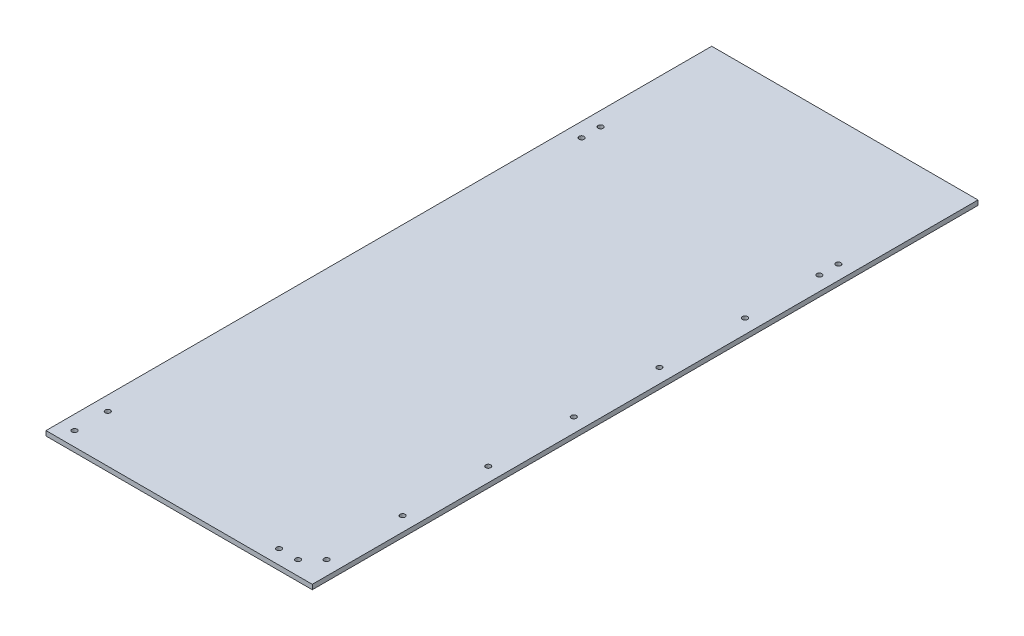
ISO-10303-21;
HEADER;
FILE_DESCRIPTION(('STEP AP214'),'2;1');
FILE_NAME('part.step','',(''),(''),'','','');
FILE_SCHEMA(('AUTOMOTIVE_DESIGN { 1 0 10303 214 1 1 1 1 }'));
ENDSEC;
DATA;
#1=APPLICATION_CONTEXT('core data for automotive mechanical design processes');
#2=APPLICATION_PROTOCOL_DEFINITION('international standard','automotive_design',2000,#1);
#3=PRODUCT_CONTEXT('',#1,'mechanical');
#4=PRODUCT('Part','Part','',(#3));
#5=PRODUCT_RELATED_PRODUCT_CATEGORY('part','',(#4));
#6=PRODUCT_DEFINITION_FORMATION('','',#4);
#7=PRODUCT_DEFINITION_CONTEXT('part definition',#1,'design');
#8=PRODUCT_DEFINITION('design','',#6,#7);
#9=PRODUCT_DEFINITION_SHAPE('','',#8);
#10=(LENGTH_UNIT() NAMED_UNIT(*) SI_UNIT(.MILLI.,.METRE.));
#11=(NAMED_UNIT(*) PLANE_ANGLE_UNIT() SI_UNIT($,.RADIAN.));
#12=(NAMED_UNIT(*) SI_UNIT($,.STERADIAN.) SOLID_ANGLE_UNIT());
#13=UNCERTAINTY_MEASURE_WITH_UNIT(LENGTH_MEASURE(1.E-05),#10,'distance_accuracy_value','');
#14=(GEOMETRIC_REPRESENTATION_CONTEXT(3) GLOBAL_UNCERTAINTY_ASSIGNED_CONTEXT((#13)) GLOBAL_UNIT_ASSIGNED_CONTEXT((#10,
#11,#12)) REPRESENTATION_CONTEXT('',''));
#15=CARTESIAN_POINT('',(0.,0.,0.));
#16=DIRECTION('',(0.,0.,1.));
#17=DIRECTION('',(1.,0.,0.));
#18=AXIS2_PLACEMENT_3D('',#15,#16,#17);
#19=CARTESIAN_POINT('',(-158.749999995191,-951.153359001941,425.450000001205));
#20=DIRECTION('',(0.,1.,0.));
#21=DIRECTION('',(1.,0.,0.));
#22=AXIS2_PLACEMENT_3D('',#19,#20,#21);
#23=CYLINDRICAL_SURFACE('',#22,3.3782);
#24=CARTESIAN_POINT('',(-158.749999995191,0.,425.450000001205));
#25=DIRECTION('',(0.,1.,0.));
#26=DIRECTION('',(1.,0.,0.));
#27=AXIS2_PLACEMENT_3D('',#24,#25,#26);
#28=CIRCLE('',#27,3.3782);
#29=CARTESIAN_POINT('',(-155.371799995191,0.,425.450000001205));
#30=VERTEX_POINT('',#29);
#31=EDGE_CURVE('E95',#30,#30,#28,.T.);
#32=ORIENTED_EDGE('',*,*,#31,.F.);
#33=EDGE_LOOP('',(#32));
#34=FACE_BOUND('',#33,.T.);
#35=CARTESIAN_POINT('',(-158.749999995191,6.35000000000005,425.450000001205));
#36=DIRECTION('',(0.,-1.,0.));
#37=DIRECTION('',(0.,0.,-1.));
#38=AXIS2_PLACEMENT_3D('',#35,#36,#37);
#39=CIRCLE('',#38,3.3782);
#40=CARTESIAN_POINT('',(-158.749999995191,6.35000000000005,422.071800001205));
#41=VERTEX_POINT('',#40);
#42=EDGE_CURVE('E76',#41,#41,#39,.T.);
#43=ORIENTED_EDGE('',*,*,#42,.F.);
#44=EDGE_LOOP('',(#43));
#45=FACE_BOUND('',#44,.T.);
#46=ADVANCED_FACE('F16',(#34,#45),#23,.F.);
#47=CARTESIAN_POINT('',(-158.749999995512,-951.153359001941,381.000000001207));
#48=DIRECTION('',(0.,1.,0.));
#49=DIRECTION('',(1.,0.,0.));
#50=AXIS2_PLACEMENT_3D('',#47,#48,#49);
#51=CYLINDRICAL_SURFACE('',#50,3.3782);
#52=CARTESIAN_POINT('',(-158.749999995512,0.,381.000000001207));
#53=DIRECTION('',(0.,1.,0.));
#54=DIRECTION('',(1.,0.,0.));
#55=AXIS2_PLACEMENT_3D('',#52,#53,#54);
#56=CIRCLE('',#55,3.3782);
#57=CARTESIAN_POINT('',(-155.371799995512,0.,381.000000001207));
#58=VERTEX_POINT('',#57);
#59=EDGE_CURVE('E170',#58,#58,#56,.T.);
#60=ORIENTED_EDGE('',*,*,#59,.F.);
#61=EDGE_LOOP('',(#60));
#62=FACE_BOUND('',#61,.T.);
#63=CARTESIAN_POINT('',(-158.749999995512,6.35000000000005,381.000000001207));
#64=DIRECTION('',(0.,-1.,0.));
#65=DIRECTION('',(0.,0.,-1.));
#66=AXIS2_PLACEMENT_3D('',#63,#64,#65);
#67=CIRCLE('',#66,3.3782);
#68=CARTESIAN_POINT('',(-158.749999995512,6.35000000000005,377.621800001207));
#69=VERTEX_POINT('',#68);
#70=EDGE_CURVE('E167',#69,#69,#67,.T.);
#71=ORIENTED_EDGE('',*,*,#70,.F.);
#72=EDGE_LOOP('',(#71));
#73=FACE_BOUND('',#72,.T.);
#74=ADVANCED_FACE('F184',(#62,#73),#51,.F.);
#75=CARTESIAN_POINT('',(158.750000004656,-951.153359001941,406.399999998914));
#76=DIRECTION('',(0.,1.,0.));
#77=DIRECTION('',(1.,0.,0.));
#78=AXIS2_PLACEMENT_3D('',#75,#76,#77);
#79=CYLINDRICAL_SURFACE('',#78,3.3782);
#80=CARTESIAN_POINT('',(158.750000004656,0.,406.399999998914));
#81=DIRECTION('',(0.,1.,0.));
#82=DIRECTION('',(1.,0.,0.));
#83=AXIS2_PLACEMENT_3D('',#80,#81,#82);
#84=CIRCLE('',#83,3.3782);
#85=CARTESIAN_POINT('',(162.128200004656,0.,406.399999998914));
#86=VERTEX_POINT('',#85);
#87=EDGE_CURVE('E164',#86,#86,#84,.T.);
#88=ORIENTED_EDGE('',*,*,#87,.F.);
#89=EDGE_LOOP('',(#88));
#90=FACE_BOUND('',#89,.T.);
#91=CARTESIAN_POINT('',(158.750000004656,6.35000000000005,406.399999998914));
#92=DIRECTION('',(0.,-1.,0.));
#93=DIRECTION('',(0.,0.,-1.));
#94=AXIS2_PLACEMENT_3D('',#91,#92,#93);
#95=CIRCLE('',#94,3.3782);
#96=CARTESIAN_POINT('',(158.750000004656,6.35000000000005,403.021799998914));
#97=VERTEX_POINT('',#96);
#98=EDGE_CURVE('E161',#97,#97,#95,.T.);
#99=ORIENTED_EDGE('',*,*,#98,.F.);
#100=EDGE_LOOP('',(#99));
#101=FACE_BOUND('',#100,.T.);
#102=ADVANCED_FACE('F342',(#90,#101),#79,.F.);
#103=CARTESIAN_POINT('',(139.700000004794,-951.153359001941,425.449999999051));
#104=DIRECTION('',(0.,1.,0.));
#105=DIRECTION('',(1.,0.,0.));
#106=AXIS2_PLACEMENT_3D('',#103,#104,#105);
#107=CYLINDRICAL_SURFACE('',#106,3.3782);
#108=CARTESIAN_POINT('',(139.700000004794,0.,425.449999999051));
#109=DIRECTION('',(0.,1.,0.));
#110=DIRECTION('',(1.,0.,0.));
#111=AXIS2_PLACEMENT_3D('',#108,#109,#110);
#112=CIRCLE('',#111,3.3782);
#113=CARTESIAN_POINT('',(143.078200004794,0.,425.449999999051));
#114=VERTEX_POINT('',#113);
#115=EDGE_CURVE('E158',#114,#114,#112,.T.);
#116=ORIENTED_EDGE('',*,*,#115,.F.);
#117=EDGE_LOOP('',(#116));
#118=FACE_BOUND('',#117,.T.);
#119=CARTESIAN_POINT('',(139.700000004794,6.35000000000005,425.449999999051));
#120=DIRECTION('',(0.,-1.,0.));
#121=DIRECTION('',(0.,0.,-1.));
#122=AXIS2_PLACEMENT_3D('',#119,#120,#121);
#123=CIRCLE('',#122,3.3782);
#124=CARTESIAN_POINT('',(139.700000004794,6.35000000000005,422.071799999051));
#125=VERTEX_POINT('',#124);
#126=EDGE_CURVE('E155',#125,#125,#123,.T.);
#127=ORIENTED_EDGE('',*,*,#126,.F.);
#128=EDGE_LOOP('',(#127));
#129=FACE_BOUND('',#128,.T.);
#130=ADVANCED_FACE('F334',(#118,#129),#107,.F.);
#131=CARTESIAN_POINT('',(114.300000004795,-951.153359001941,425.449999999234));
#132=DIRECTION('',(0.,1.,0.));
#133=DIRECTION('',(1.,0.,0.));
#134=AXIS2_PLACEMENT_3D('',#131,#132,#133);
#135=CYLINDRICAL_SURFACE('',#134,3.3782);
#136=CARTESIAN_POINT('',(114.300000004795,0.,425.449999999234));
#137=DIRECTION('',(0.,1.,0.));
#138=DIRECTION('',(1.,0.,0.));
#139=AXIS2_PLACEMENT_3D('',#136,#137,#138);
#140=CIRCLE('',#139,3.3782);
#141=CARTESIAN_POINT('',(117.678200004795,0.,425.449999999234));
#142=VERTEX_POINT('',#141);
#143=EDGE_CURVE('E152',#142,#142,#140,.T.);
#144=ORIENTED_EDGE('',*,*,#143,.F.);
#145=EDGE_LOOP('',(#144));
#146=FACE_BOUND('',#145,.T.);
#147=CARTESIAN_POINT('',(114.300000004795,6.35000000000005,425.449999999234));
#148=DIRECTION('',(0.,-1.,0.));
#149=DIRECTION('',(0.,0.,-1.));
#150=AXIS2_PLACEMENT_3D('',#147,#148,#149);
#151=CIRCLE('',#150,3.3782);
#152=CARTESIAN_POINT('',(114.300000004795,6.35000000000005,422.071799999234));
#153=VERTEX_POINT('',#152);
#154=EDGE_CURVE('E149',#153,#153,#151,.T.);
#155=ORIENTED_EDGE('',*,*,#154,.F.);
#156=EDGE_LOOP('',(#155));
#157=FACE_BOUND('',#156,.T.);
#158=ADVANCED_FACE('F326',(#146,#157),#135,.F.);
#159=CARTESIAN_POINT('',(158.750000000001,-951.153359001941,-277.109418015801));
#160=DIRECTION('',(0.,1.,0.));
#161=DIRECTION('',(1.,0.,0.));
#162=AXIS2_PLACEMENT_3D('',#159,#160,#161);
#163=CYLINDRICAL_SURFACE('',#162,3.3782);
#164=CARTESIAN_POINT('',(158.750000000001,0.,-277.109418015801));
#165=DIRECTION('',(0.,1.,0.));
#166=DIRECTION('',(1.,0.,0.));
#167=AXIS2_PLACEMENT_3D('',#164,#165,#166);
#168=CIRCLE('',#167,3.3782);
#169=CARTESIAN_POINT('',(162.128200000001,0.,-277.109418015801));
#170=VERTEX_POINT('',#169);
#171=EDGE_CURVE('E146',#170,#170,#168,.T.);
#172=ORIENTED_EDGE('',*,*,#171,.F.);
#173=EDGE_LOOP('',(#172));
#174=FACE_BOUND('',#173,.T.);
#175=CARTESIAN_POINT('',(158.750000000001,6.35000000000005,-277.109418015801));
#176=DIRECTION('',(0.,-1.,0.));
#177=DIRECTION('',(0.,0.,-1.));
#178=AXIS2_PLACEMENT_3D('',#175,#176,#177);
#179=CIRCLE('',#178,3.3782);
#180=CARTESIAN_POINT('',(158.750000000001,6.35000000000005,-280.487618015801));
#181=VERTEX_POINT('',#180);
#182=EDGE_CURVE('E143',#181,#181,#179,.T.);
#183=ORIENTED_EDGE('',*,*,#182,.F.);
#184=EDGE_LOOP('',(#183));
#185=FACE_BOUND('',#184,.T.);
#186=ADVANCED_FACE('F318',(#174,#185),#163,.F.);
#187=CARTESIAN_POINT('',(158.750000000001,-951.153359001941,-251.709418015802));
#188=DIRECTION('',(0.,1.,0.));
#189=DIRECTION('',(1.,0.,0.));
#190=AXIS2_PLACEMENT_3D('',#187,#188,#189);
#191=CYLINDRICAL_SURFACE('',#190,3.3782);
#192=CARTESIAN_POINT('',(158.750000000001,0.,-251.709418015802));
#193=DIRECTION('',(0.,1.,0.));
#194=DIRECTION('',(1.,0.,0.));
#195=AXIS2_PLACEMENT_3D('',#192,#193,#194);
#196=CIRCLE('',#195,3.3782);
#197=CARTESIAN_POINT('',(162.128200000001,0.,-251.709418015802));
#198=VERTEX_POINT('',#197);
#199=EDGE_CURVE('E140',#198,#198,#196,.T.);
#200=ORIENTED_EDGE('',*,*,#199,.F.);
#201=EDGE_LOOP('',(#200));
#202=FACE_BOUND('',#201,.T.);
#203=CARTESIAN_POINT('',(158.750000000001,6.35000000000005,-251.709418015802));
#204=DIRECTION('',(0.,-1.,0.));
#205=DIRECTION('',(0.,0.,-1.));
#206=AXIS2_PLACEMENT_3D('',#203,#204,#205);
#207=CIRCLE('',#206,3.3782);
#208=CARTESIAN_POINT('',(158.750000000001,6.35000000000005,-255.087618015802));
#209=VERTEX_POINT('',#208);
#210=EDGE_CURVE('E137',#209,#209,#207,.T.);
#211=ORIENTED_EDGE('',*,*,#210,.F.);
#212=EDGE_LOOP('',(#211));
#213=FACE_BOUND('',#212,.T.);
#214=ADVANCED_FACE('F310',(#202,#213),#191,.F.);
#215=CARTESIAN_POINT('',(-158.750000005025,-951.153359001941,-251.709418013566));
#216=DIRECTION('',(0.,1.,0.));
#217=DIRECTION('',(1.,0.,0.));
#218=AXIS2_PLACEMENT_3D('',#215,#216,#217);
#219=CYLINDRICAL_SURFACE('',#218,3.3782);
#220=CARTESIAN_POINT('',(-158.750000005025,0.,-251.709418013566));
#221=DIRECTION('',(0.,1.,0.));
#222=DIRECTION('',(1.,0.,0.));
#223=AXIS2_PLACEMENT_3D('',#220,#221,#222);
#224=CIRCLE('',#223,3.3782);
#225=CARTESIAN_POINT('',(-155.371800005025,0.,-251.709418013566));
#226=VERTEX_POINT('',#225);
#227=EDGE_CURVE('E134',#226,#226,#224,.T.);
#228=ORIENTED_EDGE('',*,*,#227,.F.);
#229=EDGE_LOOP('',(#228));
#230=FACE_BOUND('',#229,.T.);
#231=CARTESIAN_POINT('',(-158.750000005025,6.35000000000005,-251.709418013566));
#232=DIRECTION('',(0.,-1.,0.));
#233=DIRECTION('',(0.,0.,-1.));
#234=AXIS2_PLACEMENT_3D('',#231,#232,#233);
#235=CIRCLE('',#234,3.3782);
#236=CARTESIAN_POINT('',(-158.750000005025,6.35000000000005,-255.087618013566));
#237=VERTEX_POINT('',#236);
#238=EDGE_CURVE('E131',#237,#237,#235,.T.);
#239=ORIENTED_EDGE('',*,*,#238,.F.);
#240=EDGE_LOOP('',(#239));
#241=FACE_BOUND('',#240,.T.);
#242=ADVANCED_FACE('F302',(#230,#241),#219,.F.);
#243=CARTESIAN_POINT('',(-158.750000005209,-951.153359001941,-277.109418013564));
#244=DIRECTION('',(0.,1.,0.));
#245=DIRECTION('',(1.,0.,0.));
#246=AXIS2_PLACEMENT_3D('',#243,#244,#245);
#247=CYLINDRICAL_SURFACE('',#246,3.3782);
#248=CARTESIAN_POINT('',(-158.750000005209,0.,-277.109418013564));
#249=DIRECTION('',(0.,1.,0.));
#250=DIRECTION('',(1.,0.,0.));
#251=AXIS2_PLACEMENT_3D('',#248,#249,#250);
#252=CIRCLE('',#251,3.3782);
#253=CARTESIAN_POINT('',(-155.371800005209,0.,-277.109418013564));
#254=VERTEX_POINT('',#253);
#255=EDGE_CURVE('E128',#254,#254,#252,.T.);
#256=ORIENTED_EDGE('',*,*,#255,.F.);
#257=EDGE_LOOP('',(#256));
#258=FACE_BOUND('',#257,.T.);
#259=CARTESIAN_POINT('',(-158.750000005209,6.35000000000005,-277.109418013564));
#260=DIRECTION('',(0.,-1.,0.));
#261=DIRECTION('',(0.,0.,-1.));
#262=AXIS2_PLACEMENT_3D('',#259,#260,#261);
#263=CIRCLE('',#262,3.3782);
#264=CARTESIAN_POINT('',(-158.750000005209,6.35000000000005,-280.487618013564));
#265=VERTEX_POINT('',#264);
#266=EDGE_CURVE('E125',#265,#265,#263,.T.);
#267=ORIENTED_EDGE('',*,*,#266,.F.);
#268=EDGE_LOOP('',(#267));
#269=FACE_BOUND('',#268,.T.);
#270=ADVANCED_FACE('F294',(#258,#269),#247,.F.);
#271=CARTESIAN_POINT('',(158.75,-951.153359001941,-152.399999999995));
#272=DIRECTION('',(0.,1.,0.));
#273=DIRECTION('',(1.,0.,0.));
#274=AXIS2_PLACEMENT_3D('',#271,#272,#273);
#275=CYLINDRICAL_SURFACE('',#274,3.3782);
#276=CARTESIAN_POINT('',(158.75,0.,-152.399999999995));
#277=DIRECTION('',(0.,1.,0.));
#278=DIRECTION('',(1.,0.,0.));
#279=AXIS2_PLACEMENT_3D('',#276,#277,#278);
#280=CIRCLE('',#279,3.3782);
#281=CARTESIAN_POINT('',(162.1282,0.,-152.399999999995));
#282=VERTEX_POINT('',#281);
#283=EDGE_CURVE('E122',#282,#282,#280,.T.);
#284=ORIENTED_EDGE('',*,*,#283,.F.);
#285=EDGE_LOOP('',(#284));
#286=FACE_BOUND('',#285,.T.);
#287=CARTESIAN_POINT('',(158.75,6.35000000000005,-152.399999999995));
#288=DIRECTION('',(0.,-1.,0.));
#289=DIRECTION('',(0.,0.,-1.));
#290=AXIS2_PLACEMENT_3D('',#287,#288,#289);
#291=CIRCLE('',#290,3.3782);
#292=CARTESIAN_POINT('',(158.75,6.35000000000005,-155.778199999995));
#293=VERTEX_POINT('',#292);
#294=EDGE_CURVE('E119',#293,#293,#291,.T.);
#295=ORIENTED_EDGE('',*,*,#294,.F.);
#296=EDGE_LOOP('',(#295));
#297=FACE_BOUND('',#296,.T.);
#298=ADVANCED_FACE('F287',(#286,#297),#275,.F.);
#299=CARTESIAN_POINT('',(158.75,-951.153359001941,76.2000000000049));
#300=DIRECTION('',(0.,1.,0.));
#301=DIRECTION('',(1.,0.,0.));
#302=AXIS2_PLACEMENT_3D('',#299,#300,#301);
#303=CYLINDRICAL_SURFACE('',#302,3.3782);
#304=CARTESIAN_POINT('',(158.75,0.,76.2000000000049));
#305=DIRECTION('',(0.,1.,0.));
#306=DIRECTION('',(1.,0.,0.));
#307=AXIS2_PLACEMENT_3D('',#304,#305,#306);
#308=CIRCLE('',#307,3.3782);
#309=CARTESIAN_POINT('',(162.1282,0.,76.2000000000049));
#310=VERTEX_POINT('',#309);
#311=EDGE_CURVE('E111',#310,#310,#308,.T.);
#312=ORIENTED_EDGE('',*,*,#311,.F.);
#313=EDGE_LOOP('',(#312));
#314=FACE_BOUND('',#313,.T.);
#315=CARTESIAN_POINT('',(158.75,6.35000000000005,76.2000000000049));
#316=DIRECTION('',(0.,-1.,0.));
#317=DIRECTION('',(0.,0.,-1.));
#318=AXIS2_PLACEMENT_3D('',#315,#316,#317);
#319=CIRCLE('',#318,3.3782);
#320=CARTESIAN_POINT('',(158.75,6.35000000000005,72.8218000000049));
#321=VERTEX_POINT('',#320);
#322=EDGE_CURVE('E115',#321,#321,#319,.T.);
#323=ORIENTED_EDGE('',*,*,#322,.F.);
#324=EDGE_LOOP('',(#323));
#325=FACE_BOUND('',#324,.T.);
#326=ADVANCED_FACE('F228',(#314,#325),#303,.F.);
#327=CARTESIAN_POINT('',(158.75,-951.153359001941,190.500000000005));
#328=DIRECTION('',(0.,1.,0.));
#329=DIRECTION('',(1.,0.,0.));
#330=AXIS2_PLACEMENT_3D('',#327,#328,#329);
#331=CYLINDRICAL_SURFACE('',#330,3.3782);
#332=CARTESIAN_POINT('',(158.75,0.,190.500000000005));
#333=DIRECTION('',(0.,1.,0.));
#334=DIRECTION('',(1.,0.,0.));
#335=AXIS2_PLACEMENT_3D('',#332,#333,#334);
#336=CIRCLE('',#335,3.3782);
#337=CARTESIAN_POINT('',(162.1282,0.,190.500000000005));
#338=VERTEX_POINT('',#337);
#339=EDGE_CURVE('E106',#338,#338,#336,.T.);
#340=ORIENTED_EDGE('',*,*,#339,.F.);
#341=EDGE_LOOP('',(#340));
#342=FACE_BOUND('',#341,.T.);
#343=CARTESIAN_POINT('',(158.75,6.35000000000005,190.500000000005));
#344=DIRECTION('',(0.,-1.,0.));
#345=DIRECTION('',(0.,0.,-1.));
#346=AXIS2_PLACEMENT_3D('',#343,#344,#345);
#347=CIRCLE('',#346,3.3782);
#348=CARTESIAN_POINT('',(158.75,6.35000000000005,187.121800000005));
#349=VERTEX_POINT('',#348);
#350=EDGE_CURVE('E87',#349,#349,#347,.T.);
#351=ORIENTED_EDGE('',*,*,#350,.F.);
#352=EDGE_LOOP('',(#351));
#353=FACE_BOUND('',#352,.T.);
#354=ADVANCED_FACE('F217',(#342,#353),#331,.F.);
#355=CARTESIAN_POINT('',(158.75,-951.153359001941,-38.099999999995));
#356=DIRECTION('',(0.,1.,0.));
#357=DIRECTION('',(1.,0.,0.));
#358=AXIS2_PLACEMENT_3D('',#355,#356,#357);
#359=CYLINDRICAL_SURFACE('',#358,3.3782);
#360=CARTESIAN_POINT('',(158.75,0.,-38.099999999995));
#361=DIRECTION('',(0.,1.,0.));
#362=DIRECTION('',(1.,0.,0.));
#363=AXIS2_PLACEMENT_3D('',#360,#361,#362);
#364=CIRCLE('',#363,3.3782);
#365=CARTESIAN_POINT('',(162.1282,0.,-38.099999999995));
#366=VERTEX_POINT('',#365);
#367=EDGE_CURVE('E102',#366,#366,#364,.T.);
#368=ORIENTED_EDGE('',*,*,#367,.F.);
#369=EDGE_LOOP('',(#368));
#370=FACE_BOUND('',#369,.T.);
#371=CARTESIAN_POINT('',(158.75,6.35000000000005,-38.099999999995));
#372=DIRECTION('',(0.,-1.,0.));
#373=DIRECTION('',(0.,0.,-1.));
#374=AXIS2_PLACEMENT_3D('',#371,#372,#373);
#375=CIRCLE('',#374,3.3782);
#376=CARTESIAN_POINT('',(158.75,6.35000000000005,-41.478199999995));
#377=VERTEX_POINT('',#376);
#378=EDGE_CURVE('E82',#377,#377,#375,.T.);
#379=ORIENTED_EDGE('',*,*,#378,.F.);
#380=EDGE_LOOP('',(#379));
#381=FACE_BOUND('',#380,.T.);
#382=ADVANCED_FACE('F214',(#370,#381),#359,.F.);
#383=CARTESIAN_POINT('',(158.75,-951.153359001941,304.800000000005));
#384=DIRECTION('',(0.,1.,0.));
#385=DIRECTION('',(1.,0.,0.));
#386=AXIS2_PLACEMENT_3D('',#383,#384,#385);
#387=CYLINDRICAL_SURFACE('',#386,3.3782);
#388=CARTESIAN_POINT('',(158.75,0.,304.800000000005));
#389=DIRECTION('',(0.,1.,0.));
#390=DIRECTION('',(1.,0.,0.));
#391=AXIS2_PLACEMENT_3D('',#388,#389,#390);
#392=CIRCLE('',#391,3.3782);
#393=CARTESIAN_POINT('',(162.1282,0.,304.800000000005));
#394=VERTEX_POINT('',#393);
#395=EDGE_CURVE('E91',#394,#394,#392,.T.);
#396=ORIENTED_EDGE('',*,*,#395,.F.);
#397=EDGE_LOOP('',(#396));
#398=FACE_BOUND('',#397,.T.);
#399=CARTESIAN_POINT('',(158.75,6.35000000000005,304.800000000005));
#400=DIRECTION('',(0.,-1.,0.));
#401=DIRECTION('',(0.,0.,-1.));
#402=AXIS2_PLACEMENT_3D('',#399,#400,#401);
#403=CIRCLE('',#402,3.3782);
#404=CARTESIAN_POINT('',(158.75,6.35000000000005,301.421800000005));
#405=VERTEX_POINT('',#404);
#406=EDGE_CURVE('E80',#405,#405,#403,.T.);
#407=ORIENTED_EDGE('',*,*,#406,.F.);
#408=EDGE_LOOP('',(#407));
#409=FACE_BOUND('',#408,.T.);
#410=ADVANCED_FACE('F216',(#398,#409),#387,.F.);
#411=CARTESIAN_POINT('',(-177.8,0.,-444.5));
#412=DIRECTION('',(-1.,0.,0.));
#413=DIRECTION('',(0.,0.,1.));
#414=AXIS2_PLACEMENT_3D('',#411,#412,#413);
#415=PLANE('',#414);
#416=DIRECTION('',(0.,0.,-1.));
#417=VECTOR('',#416,1.);
#418=CARTESIAN_POINT('',(-177.8,0.,444.5));
#419=LINE('',#418,#417);
#420=CARTESIAN_POINT('',(-177.8,0.,444.5));
#421=VERTEX_POINT('',#420);
#422=CARTESIAN_POINT('',(-177.8,0.,-444.5));
#423=VERTEX_POINT('',#422);
#424=EDGE_CURVE('E34',#421,#423,#419,.T.);
#425=ORIENTED_EDGE('',*,*,#424,.F.);
#426=DIRECTION('',(0.,1.,0.));
#427=VECTOR('',#426,1.);
#428=CARTESIAN_POINT('',(-177.8,0.,444.5));
#429=LINE('',#428,#427);
#430=CARTESIAN_POINT('',(-177.8,6.35,444.5));
#431=VERTEX_POINT('',#430);
#432=EDGE_CURVE('E11',#421,#431,#429,.T.);
#433=ORIENTED_EDGE('',*,*,#432,.T.);
#434=DIRECTION('',(0.,0.,1.));
#435=VECTOR('',#434,1.);
#436=CARTESIAN_POINT('',(-177.8,6.35,444.5));
#437=LINE('',#436,#435);
#438=CARTESIAN_POINT('',(-177.8,6.35,-444.5));
#439=VERTEX_POINT('',#438);
#440=EDGE_CURVE('E79',#439,#431,#437,.T.);
#441=ORIENTED_EDGE('',*,*,#440,.F.);
#442=DIRECTION('',(0.,1.,0.));
#443=VECTOR('',#442,1.);
#444=CARTESIAN_POINT('',(-177.8,0.,-444.5));
#445=LINE('',#444,#443);
#446=EDGE_CURVE('E26',#423,#439,#445,.T.);
#447=ORIENTED_EDGE('',*,*,#446,.F.);
#448=EDGE_LOOP('',(#425,#433,#441,#447));
#449=FACE_BOUND('',#448,.T.);
#450=ADVANCED_FACE('F225',(#449),#415,.T.);
#451=CARTESIAN_POINT('',(177.8,0.,-444.5));
#452=DIRECTION('',(0.,0.,-1.));
#453=DIRECTION('',(-1.,0.,0.));
#454=AXIS2_PLACEMENT_3D('',#451,#452,#453);
#455=PLANE('',#454);
#456=DIRECTION('',(1.,0.,0.));
#457=VECTOR('',#456,1.);
#458=CARTESIAN_POINT('',(-177.8,0.,-444.5));
#459=LINE('',#458,#457);
#460=CARTESIAN_POINT('',(177.8,0.,-444.5));
#461=VERTEX_POINT('',#460);
#462=EDGE_CURVE('E92',#423,#461,#459,.T.);
#463=ORIENTED_EDGE('',*,*,#462,.F.);
#464=ORIENTED_EDGE('',*,*,#446,.T.);
#465=DIRECTION('',(-1.,0.,0.));
#466=VECTOR('',#465,1.);
#467=CARTESIAN_POINT('',(-177.8,6.35,-444.5));
#468=LINE('',#467,#466);
#469=CARTESIAN_POINT('',(177.8,6.35,-444.5));
#470=VERTEX_POINT('',#469);
#471=EDGE_CURVE('E70',#470,#439,#468,.T.);
#472=ORIENTED_EDGE('',*,*,#471,.F.);
#473=DIRECTION('',(0.,1.,0.));
#474=VECTOR('',#473,1.);
#475=CARTESIAN_POINT('',(177.8,0.,-444.5));
#476=LINE('',#475,#474);
#477=EDGE_CURVE('E66',#461,#470,#476,.T.);
#478=ORIENTED_EDGE('',*,*,#477,.F.);
#479=EDGE_LOOP('',(#463,#464,#472,#478));
#480=FACE_BOUND('',#479,.T.);
#481=ADVANCED_FACE('F235',(#480),#455,.T.);
#482=CARTESIAN_POINT('',(177.8,0.,444.5));
#483=DIRECTION('',(1.,0.,0.));
#484=DIRECTION('',(0.,0.,-1.));
#485=AXIS2_PLACEMENT_3D('',#482,#483,#484);
#486=PLANE('',#485);
#487=DIRECTION('',(0.,0.,1.));
#488=VECTOR('',#487,1.);
#489=CARTESIAN_POINT('',(177.8,0.,-444.5));
#490=LINE('',#489,#488);
#491=CARTESIAN_POINT('',(177.8,0.,444.5));
#492=VERTEX_POINT('',#491);
#493=EDGE_CURVE('E54',#461,#492,#490,.T.);
#494=ORIENTED_EDGE('',*,*,#493,.F.);
#495=ORIENTED_EDGE('',*,*,#477,.T.);
#496=DIRECTION('',(0.,0.,-1.));
#497=VECTOR('',#496,1.);
#498=CARTESIAN_POINT('',(177.8,6.35,-444.5));
#499=LINE('',#498,#497);
#500=CARTESIAN_POINT('',(177.8,6.35,444.5));
#501=VERTEX_POINT('',#500);
#502=EDGE_CURVE('E60',#501,#470,#499,.T.);
#503=ORIENTED_EDGE('',*,*,#502,.F.);
#504=DIRECTION('',(0.,1.,0.));
#505=VECTOR('',#504,1.);
#506=CARTESIAN_POINT('',(177.8,0.,444.5));
#507=LINE('',#506,#505);
#508=EDGE_CURVE('E63',#492,#501,#507,.T.);
#509=ORIENTED_EDGE('',*,*,#508,.F.);
#510=EDGE_LOOP('',(#494,#495,#503,#509));
#511=FACE_BOUND('',#510,.T.);
#512=ADVANCED_FACE('F62',(#511),#486,.T.);
#513=CARTESIAN_POINT('',(-177.8,0.,444.5));
#514=DIRECTION('',(0.,0.,1.));
#515=DIRECTION('',(1.,0.,0.));
#516=AXIS2_PLACEMENT_3D('',#513,#514,#515);
#517=PLANE('',#516);
#518=DIRECTION('',(-1.,0.,0.));
#519=VECTOR('',#518,1.);
#520=CARTESIAN_POINT('',(177.8,0.,444.5));
#521=LINE('',#520,#519);
#522=EDGE_CURVE('E75',#492,#421,#521,.T.);
#523=ORIENTED_EDGE('',*,*,#522,.F.);
#524=ORIENTED_EDGE('',*,*,#508,.T.);
#525=DIRECTION('',(1.,0.,0.));
#526=VECTOR('',#525,1.);
#527=CARTESIAN_POINT('',(177.8,6.35,444.5));
#528=LINE('',#527,#526);
#529=EDGE_CURVE('E20',#431,#501,#528,.T.);
#530=ORIENTED_EDGE('',*,*,#529,.F.);
#531=ORIENTED_EDGE('',*,*,#432,.F.);
#532=EDGE_LOOP('',(#523,#524,#530,#531));
#533=FACE_BOUND('',#532,.T.);
#534=ADVANCED_FACE('F74',(#533),#517,.T.);
#535=CARTESIAN_POINT('',(0.,6.35,0.));
#536=DIRECTION('',(0.,1.,0.));
#537=DIRECTION('',(0.,0.,1.));
#538=AXIS2_PLACEMENT_3D('',#535,#536,#537);
#539=PLANE('',#538);
#540=ORIENTED_EDGE('',*,*,#42,.T.);
#541=EDGE_LOOP('',(#540));
#542=FACE_BOUND('',#541,.T.);
#543=ORIENTED_EDGE('',*,*,#70,.T.);
#544=EDGE_LOOP('',(#543));
#545=FACE_BOUND('',#544,.T.);
#546=ORIENTED_EDGE('',*,*,#98,.T.);
#547=EDGE_LOOP('',(#546));
#548=FACE_BOUND('',#547,.T.);
#549=ORIENTED_EDGE('',*,*,#126,.T.);
#550=EDGE_LOOP('',(#549));
#551=FACE_BOUND('',#550,.T.);
#552=ORIENTED_EDGE('',*,*,#154,.T.);
#553=EDGE_LOOP('',(#552));
#554=FACE_BOUND('',#553,.T.);
#555=ORIENTED_EDGE('',*,*,#182,.T.);
#556=EDGE_LOOP('',(#555));
#557=FACE_BOUND('',#556,.T.);
#558=ORIENTED_EDGE('',*,*,#210,.T.);
#559=EDGE_LOOP('',(#558));
#560=FACE_BOUND('',#559,.T.);
#561=ORIENTED_EDGE('',*,*,#238,.T.);
#562=EDGE_LOOP('',(#561));
#563=FACE_BOUND('',#562,.T.);
#564=ORIENTED_EDGE('',*,*,#266,.T.);
#565=EDGE_LOOP('',(#564));
#566=FACE_BOUND('',#565,.T.);
#567=ORIENTED_EDGE('',*,*,#294,.T.);
#568=EDGE_LOOP('',(#567));
#569=FACE_BOUND('',#568,.T.);
#570=ORIENTED_EDGE('',*,*,#322,.T.);
#571=EDGE_LOOP('',(#570));
#572=FACE_BOUND('',#571,.T.);
#573=ORIENTED_EDGE('',*,*,#350,.T.);
#574=EDGE_LOOP('',(#573));
#575=FACE_BOUND('',#574,.T.);
#576=ORIENTED_EDGE('',*,*,#378,.T.);
#577=EDGE_LOOP('',(#576));
#578=FACE_BOUND('',#577,.T.);
#579=ORIENTED_EDGE('',*,*,#406,.T.);
#580=EDGE_LOOP('',(#579));
#581=FACE_BOUND('',#580,.T.);
#582=ORIENTED_EDGE('',*,*,#529,.T.);
#583=ORIENTED_EDGE('',*,*,#502,.T.);
#584=ORIENTED_EDGE('',*,*,#471,.T.);
#585=ORIENTED_EDGE('',*,*,#440,.T.);
#586=EDGE_LOOP('',(#582,#583,#584,#585));
#587=FACE_BOUND('',#586,.T.);
#588=ADVANCED_FACE('F78',(#542,#545,#548,#551,#554,#557,#560,#563,#566,#569,#572,#575,#578,#581,
#587),#539,.T.);
#589=CARTESIAN_POINT('',(0.,0.,0.));
#590=DIRECTION('',(0.,1.,0.));
#591=DIRECTION('',(0.,0.,1.));
#592=AXIS2_PLACEMENT_3D('',#589,#590,#591);
#593=PLANE('',#592);
#594=ORIENTED_EDGE('',*,*,#31,.T.);
#595=EDGE_LOOP('',(#594));
#596=FACE_BOUND('',#595,.T.);
#597=ORIENTED_EDGE('',*,*,#59,.T.);
#598=EDGE_LOOP('',(#597));
#599=FACE_BOUND('',#598,.T.);
#600=ORIENTED_EDGE('',*,*,#87,.T.);
#601=EDGE_LOOP('',(#600));
#602=FACE_BOUND('',#601,.T.);
#603=ORIENTED_EDGE('',*,*,#115,.T.);
#604=EDGE_LOOP('',(#603));
#605=FACE_BOUND('',#604,.T.);
#606=ORIENTED_EDGE('',*,*,#143,.T.);
#607=EDGE_LOOP('',(#606));
#608=FACE_BOUND('',#607,.T.);
#609=ORIENTED_EDGE('',*,*,#171,.T.);
#610=EDGE_LOOP('',(#609));
#611=FACE_BOUND('',#610,.T.);
#612=ORIENTED_EDGE('',*,*,#199,.T.);
#613=EDGE_LOOP('',(#612));
#614=FACE_BOUND('',#613,.T.);
#615=ORIENTED_EDGE('',*,*,#227,.T.);
#616=EDGE_LOOP('',(#615));
#617=FACE_BOUND('',#616,.T.);
#618=ORIENTED_EDGE('',*,*,#255,.T.);
#619=EDGE_LOOP('',(#618));
#620=FACE_BOUND('',#619,.T.);
#621=ORIENTED_EDGE('',*,*,#283,.T.);
#622=EDGE_LOOP('',(#621));
#623=FACE_BOUND('',#622,.T.);
#624=ORIENTED_EDGE('',*,*,#311,.T.);
#625=EDGE_LOOP('',(#624));
#626=FACE_BOUND('',#625,.T.);
#627=ORIENTED_EDGE('',*,*,#339,.T.);
#628=EDGE_LOOP('',(#627));
#629=FACE_BOUND('',#628,.T.);
#630=ORIENTED_EDGE('',*,*,#367,.T.);
#631=EDGE_LOOP('',(#630));
#632=FACE_BOUND('',#631,.T.);
#633=ORIENTED_EDGE('',*,*,#395,.T.);
#634=EDGE_LOOP('',(#633));
#635=FACE_BOUND('',#634,.T.);
#636=ORIENTED_EDGE('',*,*,#522,.T.);
#637=ORIENTED_EDGE('',*,*,#424,.T.);
#638=ORIENTED_EDGE('',*,*,#462,.T.);
#639=ORIENTED_EDGE('',*,*,#493,.T.);
#640=EDGE_LOOP('',(#636,#637,#638,#639));
#641=FACE_BOUND('',#640,.T.);
#642=ADVANCED_FACE('F18',(#596,#599,#602,#605,#608,#611,#614,#617,#620,#623,#626,#629,#632,#635,
#641),#593,.F.);
#643=CLOSED_SHELL('',(#46,#74,#102,#130,#158,#186,#214,#242,#270,#298,#326,#354,#382,#410,#450,
#481,#512,#534,#588,#642));
#644=MANIFOLD_SOLID_BREP('B1',#643);
#645=ADVANCED_BREP_SHAPE_REPRESENTATION('',(#18,#644),#14);
#646=SHAPE_DEFINITION_REPRESENTATION(#9,#645);
ENDSEC;
END-ISO-10303-21;
